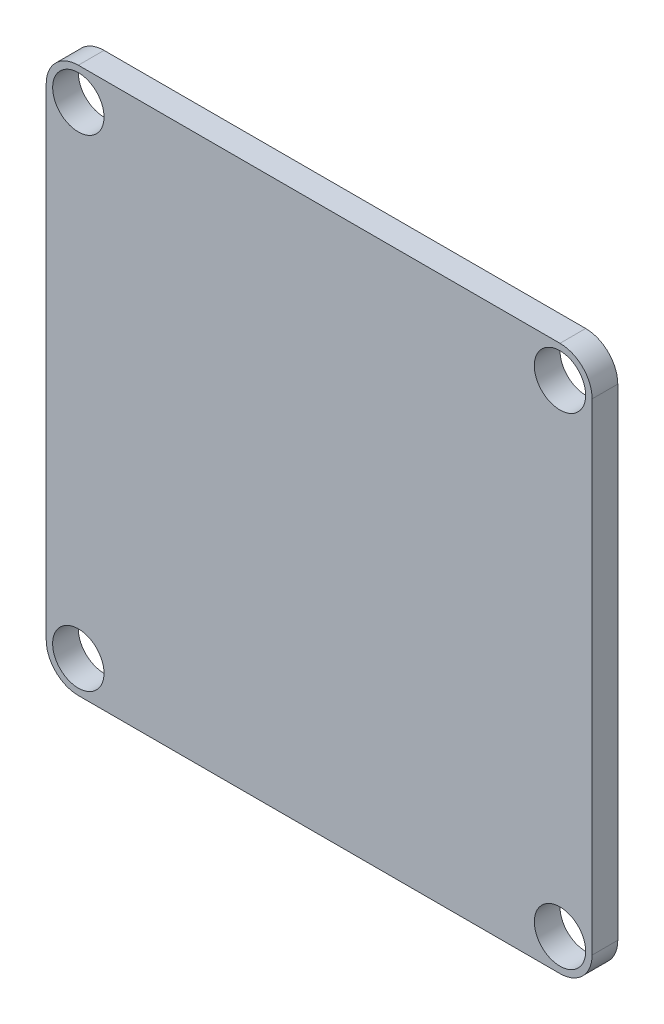
ISO-10303-21;
HEADER;
FILE_DESCRIPTION(('STEP AP214'),'2;1');
FILE_NAME('part.step','',(''),(''),'','','');
FILE_SCHEMA(('AUTOMOTIVE_DESIGN { 1 0 10303 214 1 1 1 1 }'));
ENDSEC;
DATA;
#1=APPLICATION_CONTEXT('core data for automotive mechanical design processes');
#2=APPLICATION_PROTOCOL_DEFINITION('international standard','automotive_design',2000,#1);
#3=PRODUCT_CONTEXT('',#1,'mechanical');
#4=PRODUCT('Part','Part','',(#3));
#5=PRODUCT_RELATED_PRODUCT_CATEGORY('part','',(#4));
#6=PRODUCT_DEFINITION_FORMATION('','',#4);
#7=PRODUCT_DEFINITION_CONTEXT('part definition',#1,'design');
#8=PRODUCT_DEFINITION('design','',#6,#7);
#9=PRODUCT_DEFINITION_SHAPE('','',#8);
#10=(LENGTH_UNIT() NAMED_UNIT(*) SI_UNIT(.MILLI.,.METRE.));
#11=(NAMED_UNIT(*) PLANE_ANGLE_UNIT() SI_UNIT($,.RADIAN.));
#12=(NAMED_UNIT(*) SI_UNIT($,.STERADIAN.) SOLID_ANGLE_UNIT());
#13=UNCERTAINTY_MEASURE_WITH_UNIT(LENGTH_MEASURE(1.E-05),#10,'distance_accuracy_value','');
#14=(GEOMETRIC_REPRESENTATION_CONTEXT(3) GLOBAL_UNCERTAINTY_ASSIGNED_CONTEXT((#13)) GLOBAL_UNIT_ASSIGNED_CONTEXT((#10,
#11,#12)) REPRESENTATION_CONTEXT('',''));
#15=CARTESIAN_POINT('',(0.,0.,0.));
#16=DIRECTION('',(0.,0.,1.));
#17=DIRECTION('',(1.,0.,0.));
#18=AXIS2_PLACEMENT_3D('',#15,#16,#17);
#19=CARTESIAN_POINT('',(-13.2356576243425,11.611622238612,1.6));
#20=DIRECTION('',(0.,0.,1.));
#21=DIRECTION('',(1.,0.,0.));
#22=AXIS2_PLACEMENT_3D('',#19,#20,#21);
#23=PLANE('',#22);
#24=CARTESIAN_POINT('',(-13.2356576243425,11.611622238612,1.6));
#25=DIRECTION('',(0.,0.,1.));
#26=DIRECTION('',(-1.,0.,0.));
#27=AXIS2_PLACEMENT_3D('',#24,#25,#26);
#28=CIRCLE('',#27,1.6);
#29=CARTESIAN_POINT('',(-14.8356576243425,11.611622238612,1.6));
#30=VERTEX_POINT('',#29);
#31=EDGE_CURVE('E187',#30,#30,#28,.T.);
#32=ORIENTED_EDGE('',*,*,#31,.F.);
#33=EDGE_LOOP('',(#32));
#34=FACE_BOUND('',#33,.T.);
#35=CARTESIAN_POINT('',(16.7643423756575,11.611622238612,1.6));
#36=DIRECTION('',(0.,0.,1.));
#37=DIRECTION('',(1.,0.,0.));
#38=AXIS2_PLACEMENT_3D('',#35,#36,#37);
#39=CIRCLE('',#38,1.6);
#40=CARTESIAN_POINT('',(18.3643423756575,11.611622238612,1.6));
#41=VERTEX_POINT('',#40);
#42=EDGE_CURVE('E133',#41,#41,#39,.T.);
#43=ORIENTED_EDGE('',*,*,#42,.F.);
#44=EDGE_LOOP('',(#43));
#45=FACE_BOUND('',#44,.T.);
#46=CARTESIAN_POINT('',(-13.2356576243425,11.611622238612,1.6));
#47=DIRECTION('',(0.,0.,1.));
#48=DIRECTION('',(1.,0.,0.));
#49=AXIS2_PLACEMENT_3D('',#46,#47,#48);
#50=CIRCLE('',#49,2.);
#51=CARTESIAN_POINT('',(-13.2356576243425,13.611622238612,1.6));
#52=VERTEX_POINT('',#51);
#53=CARTESIAN_POINT('',(-15.2356576243425,11.611622238612,1.6));
#54=VERTEX_POINT('',#53);
#55=EDGE_CURVE('E144',#52,#54,#50,.T.);
#56=ORIENTED_EDGE('',*,*,#55,.T.);
#57=DIRECTION('',(0.,-1.,0.));
#58=VECTOR('',#57,1.);
#59=CARTESIAN_POINT('',(-15.2356576243425,11.611622238612,1.6));
#60=LINE('',#59,#58);
#61=CARTESIAN_POINT('',(-15.2356576243425,-18.388377761388,1.6));
#62=VERTEX_POINT('',#61);
#63=EDGE_CURVE('E92',#54,#62,#60,.T.);
#64=ORIENTED_EDGE('',*,*,#63,.T.);
#65=CARTESIAN_POINT('',(-13.2356576243425,-18.388377761388,1.6));
#66=DIRECTION('',(0.,0.,1.));
#67=DIRECTION('',(1.,0.,0.));
#68=AXIS2_PLACEMENT_3D('',#65,#66,#67);
#69=CIRCLE('',#68,2.);
#70=CARTESIAN_POINT('',(-13.2356576243425,-20.388377761388,1.6));
#71=VERTEX_POINT('',#70);
#72=EDGE_CURVE('E159',#62,#71,#69,.T.);
#73=ORIENTED_EDGE('',*,*,#72,.T.);
#74=DIRECTION('',(1.,0.,0.));
#75=VECTOR('',#74,1.);
#76=CARTESIAN_POINT('',(-13.2356576243425,-20.388377761388,1.6));
#77=LINE('',#76,#75);
#78=CARTESIAN_POINT('',(16.7643423756575,-20.388377761388,1.6));
#79=VERTEX_POINT('',#78);
#80=EDGE_CURVE('E172',#71,#79,#77,.T.);
#81=ORIENTED_EDGE('',*,*,#80,.T.);
#82=CARTESIAN_POINT('',(16.7643423756575,-18.388377761388,1.6));
#83=DIRECTION('',(0.,0.,1.));
#84=DIRECTION('',(1.,0.,0.));
#85=AXIS2_PLACEMENT_3D('',#82,#83,#84);
#86=CIRCLE('',#85,2.);
#87=CARTESIAN_POINT('',(18.7643423756575,-18.388377761388,1.6));
#88=VERTEX_POINT('',#87);
#89=EDGE_CURVE('E111',#79,#88,#86,.T.);
#90=ORIENTED_EDGE('',*,*,#89,.T.);
#91=DIRECTION('',(0.,1.,0.));
#92=VECTOR('',#91,1.);
#93=CARTESIAN_POINT('',(18.7643423756575,11.611622238612,1.6));
#94=LINE('',#93,#92);
#95=CARTESIAN_POINT('',(18.7643423756575,11.611622238612,1.6));
#96=VERTEX_POINT('',#95);
#97=EDGE_CURVE('E105',#88,#96,#94,.T.);
#98=ORIENTED_EDGE('',*,*,#97,.T.);
#99=CARTESIAN_POINT('',(16.7643423756575,11.611622238612,1.6));
#100=DIRECTION('',(0.,0.,1.));
#101=DIRECTION('',(-1.,0.,0.));
#102=AXIS2_PLACEMENT_3D('',#99,#100,#101);
#103=CIRCLE('',#102,2.);
#104=CARTESIAN_POINT('',(16.7643423756575,13.611622238612,1.6));
#105=VERTEX_POINT('',#104);
#106=EDGE_CURVE('E109',#96,#105,#103,.T.);
#107=ORIENTED_EDGE('',*,*,#106,.T.);
#108=DIRECTION('',(-1.,0.,0.));
#109=VECTOR('',#108,1.);
#110=CARTESIAN_POINT('',(-13.2356576243425,13.611622238612,1.6));
#111=LINE('',#110,#109);
#112=EDGE_CURVE('E49',#105,#52,#111,.T.);
#113=ORIENTED_EDGE('',*,*,#112,.T.);
#114=EDGE_LOOP('',(#56,#64,#73,#81,#90,#98,#107,#113));
#115=FACE_BOUND('',#114,.T.);
#116=CARTESIAN_POINT('',(16.7643423756575,-18.388377761388,1.6));
#117=DIRECTION('',(0.,0.,1.));
#118=DIRECTION('',(-1.,0.,0.));
#119=AXIS2_PLACEMENT_3D('',#116,#117,#118);
#120=CIRCLE('',#119,1.6);
#121=CARTESIAN_POINT('',(15.1643423756575,-18.388377761388,1.6));
#122=VERTEX_POINT('',#121);
#123=EDGE_CURVE('E181',#122,#122,#120,.T.);
#124=ORIENTED_EDGE('',*,*,#123,.F.);
#125=EDGE_LOOP('',(#124));
#126=FACE_BOUND('',#125,.T.);
#127=CARTESIAN_POINT('',(-13.2356576243425,-18.388377761388,1.6));
#128=DIRECTION('',(0.,0.,1.));
#129=DIRECTION('',(1.,0.,0.));
#130=AXIS2_PLACEMENT_3D('',#127,#128,#129);
#131=CIRCLE('',#130,1.6);
#132=CARTESIAN_POINT('',(-11.6356576243425,-18.388377761388,1.6));
#133=VERTEX_POINT('',#132);
#134=EDGE_CURVE('E193',#133,#133,#131,.T.);
#135=ORIENTED_EDGE('',*,*,#134,.F.);
#136=EDGE_LOOP('',(#135));
#137=FACE_BOUND('',#136,.T.);
#138=ADVANCED_FACE('F32',(#34,#45,#115,#126,#137),#23,.T.);
#139=CARTESIAN_POINT('',(-13.2356576243425,11.611622238612,0.));
#140=DIRECTION('',(0.,0.,1.));
#141=DIRECTION('',(1.,0.,0.));
#142=AXIS2_PLACEMENT_3D('',#139,#140,#141);
#143=PLANE('',#142);
#144=CARTESIAN_POINT('',(-13.2356576243425,11.611622238612,0.));
#145=DIRECTION('',(0.,0.,1.));
#146=DIRECTION('',(1.,0.,0.));
#147=AXIS2_PLACEMENT_3D('',#144,#145,#146);
#148=CIRCLE('',#147,2.);
#149=CARTESIAN_POINT('',(-13.2356576243425,13.611622238612,0.));
#150=VERTEX_POINT('',#149);
#151=CARTESIAN_POINT('',(-15.2356576243425,11.611622238612,0.));
#152=VERTEX_POINT('',#151);
#153=EDGE_CURVE('E129',#150,#152,#148,.T.);
#154=ORIENTED_EDGE('',*,*,#153,.F.);
#155=DIRECTION('',(-1.,0.,0.));
#156=VECTOR('',#155,1.);
#157=CARTESIAN_POINT('',(-13.2356576243425,13.611622238612,0.));
#158=LINE('',#157,#156);
#159=CARTESIAN_POINT('',(16.7643423756575,13.611622238612,0.));
#160=VERTEX_POINT('',#159);
#161=EDGE_CURVE('E84',#160,#150,#158,.T.);
#162=ORIENTED_EDGE('',*,*,#161,.F.);
#163=CARTESIAN_POINT('',(16.7643423756575,11.611622238612,0.));
#164=DIRECTION('',(0.,0.,1.));
#165=DIRECTION('',(-1.,0.,0.));
#166=AXIS2_PLACEMENT_3D('',#163,#164,#165);
#167=CIRCLE('',#166,2.);
#168=CARTESIAN_POINT('',(18.7643423756575,11.611622238612,0.));
#169=VERTEX_POINT('',#168);
#170=EDGE_CURVE('E78',#169,#160,#167,.T.);
#171=ORIENTED_EDGE('',*,*,#170,.F.);
#172=DIRECTION('',(0.,1.,0.));
#173=VECTOR('',#172,1.);
#174=CARTESIAN_POINT('',(18.7643423756575,11.611622238612,0.));
#175=LINE('',#174,#173);
#176=CARTESIAN_POINT('',(18.7643423756575,-18.388377761388,0.));
#177=VERTEX_POINT('',#176);
#178=EDGE_CURVE('E119',#177,#169,#175,.T.);
#179=ORIENTED_EDGE('',*,*,#178,.F.);
#180=CARTESIAN_POINT('',(16.7643423756575,-18.388377761388,0.));
#181=DIRECTION('',(0.,0.,1.));
#182=DIRECTION('',(1.,0.,0.));
#183=AXIS2_PLACEMENT_3D('',#180,#181,#182);
#184=CIRCLE('',#183,2.);
#185=CARTESIAN_POINT('',(16.7643423756575,-20.388377761388,0.));
#186=VERTEX_POINT('',#185);
#187=EDGE_CURVE('E139',#186,#177,#184,.T.);
#188=ORIENTED_EDGE('',*,*,#187,.F.);
#189=DIRECTION('',(1.,0.,0.));
#190=VECTOR('',#189,1.);
#191=CARTESIAN_POINT('',(-13.2356576243425,-20.388377761388,0.));
#192=LINE('',#191,#190);
#193=CARTESIAN_POINT('',(-13.2356576243425,-20.388377761388,0.));
#194=VERTEX_POINT('',#193);
#195=EDGE_CURVE('E137',#194,#186,#192,.T.);
#196=ORIENTED_EDGE('',*,*,#195,.F.);
#197=CARTESIAN_POINT('',(-13.2356576243425,-18.388377761388,0.));
#198=DIRECTION('',(0.,0.,1.));
#199=DIRECTION('',(1.,0.,0.));
#200=AXIS2_PLACEMENT_3D('',#197,#198,#199);
#201=CIRCLE('',#200,2.);
#202=CARTESIAN_POINT('',(-15.2356576243425,-18.388377761388,0.));
#203=VERTEX_POINT('',#202);
#204=EDGE_CURVE('E135',#203,#194,#201,.T.);
#205=ORIENTED_EDGE('',*,*,#204,.F.);
#206=DIRECTION('',(0.,-1.,0.));
#207=VECTOR('',#206,1.);
#208=CARTESIAN_POINT('',(-15.2356576243425,11.611622238612,0.));
#209=LINE('',#208,#207);
#210=EDGE_CURVE('E132',#152,#203,#209,.T.);
#211=ORIENTED_EDGE('',*,*,#210,.F.);
#212=EDGE_LOOP('',(#154,#162,#171,#179,#188,#196,#205,#211));
#213=FACE_BOUND('',#212,.T.);
#214=CARTESIAN_POINT('',(16.7643423756575,11.611622238612,0.));
#215=DIRECTION('',(0.,0.,1.));
#216=DIRECTION('',(1.,0.,0.));
#217=AXIS2_PLACEMENT_3D('',#214,#215,#216);
#218=CIRCLE('',#217,1.6);
#219=CARTESIAN_POINT('',(18.3643423756575,11.611622238612,0.));
#220=VERTEX_POINT('',#219);
#221=EDGE_CURVE('E178',#220,#220,#218,.T.);
#222=ORIENTED_EDGE('',*,*,#221,.T.);
#223=EDGE_LOOP('',(#222));
#224=FACE_BOUND('',#223,.T.);
#225=CARTESIAN_POINT('',(16.7643423756575,-18.388377761388,0.));
#226=DIRECTION('',(0.,0.,1.));
#227=DIRECTION('',(-1.,0.,0.));
#228=AXIS2_PLACEMENT_3D('',#225,#226,#227);
#229=CIRCLE('',#228,1.6);
#230=CARTESIAN_POINT('',(15.1643423756575,-18.388377761388,0.));
#231=VERTEX_POINT('',#230);
#232=EDGE_CURVE('E184',#231,#231,#229,.T.);
#233=ORIENTED_EDGE('',*,*,#232,.T.);
#234=EDGE_LOOP('',(#233));
#235=FACE_BOUND('',#234,.T.);
#236=CARTESIAN_POINT('',(-13.2356576243425,11.611622238612,0.));
#237=DIRECTION('',(0.,0.,1.));
#238=DIRECTION('',(-1.,0.,0.));
#239=AXIS2_PLACEMENT_3D('',#236,#237,#238);
#240=CIRCLE('',#239,1.6);
#241=CARTESIAN_POINT('',(-14.8356576243425,11.611622238612,0.));
#242=VERTEX_POINT('',#241);
#243=EDGE_CURVE('E190',#242,#242,#240,.T.);
#244=ORIENTED_EDGE('',*,*,#243,.T.);
#245=EDGE_LOOP('',(#244));
#246=FACE_BOUND('',#245,.T.);
#247=CARTESIAN_POINT('',(-13.2356576243425,-18.388377761388,0.));
#248=DIRECTION('',(0.,0.,1.));
#249=DIRECTION('',(1.,0.,0.));
#250=AXIS2_PLACEMENT_3D('',#247,#248,#249);
#251=CIRCLE('',#250,1.6);
#252=CARTESIAN_POINT('',(-11.6356576243425,-18.388377761388,0.));
#253=VERTEX_POINT('',#252);
#254=EDGE_CURVE('E196',#253,#253,#251,.T.);
#255=ORIENTED_EDGE('',*,*,#254,.T.);
#256=EDGE_LOOP('',(#255));
#257=FACE_BOUND('',#256,.T.);
#258=ADVANCED_FACE('F163',(#213,#224,#235,#246,#257),#143,.F.);
#259=CARTESIAN_POINT('',(-13.2356576243425,11.611622238612,1.6));
#260=DIRECTION('',(0.,0.,-1.));
#261=DIRECTION('',(-1.,0.,0.));
#262=AXIS2_PLACEMENT_3D('',#259,#260,#261);
#263=CYLINDRICAL_SURFACE('',#262,2.);
#264=ORIENTED_EDGE('',*,*,#153,.T.);
#265=DIRECTION('',(0.,0.,-1.));
#266=VECTOR('',#265,1.);
#267=CARTESIAN_POINT('',(-15.2356576243425,11.611622238612,1.6));
#268=LINE('',#267,#266);
#269=EDGE_CURVE('E11',#54,#152,#268,.T.);
#270=ORIENTED_EDGE('',*,*,#269,.F.);
#271=ORIENTED_EDGE('',*,*,#55,.F.);
#272=DIRECTION('',(0.,0.,-1.));
#273=VECTOR('',#272,1.);
#274=CARTESIAN_POINT('',(-13.2356576243425,13.611622238612,1.6));
#275=LINE('',#274,#273);
#276=EDGE_CURVE('E125',#52,#150,#275,.T.);
#277=ORIENTED_EDGE('',*,*,#276,.T.);
#278=EDGE_LOOP('',(#264,#270,#271,#277));
#279=FACE_BOUND('',#278,.T.);
#280=ADVANCED_FACE('F34',(#279),#263,.T.);
#281=CARTESIAN_POINT('',(-15.2356576243425,11.611622238612,1.6));
#282=DIRECTION('',(1.,0.,0.));
#283=DIRECTION('',(0.,1.,0.));
#284=AXIS2_PLACEMENT_3D('',#281,#282,#283);
#285=PLANE('',#284);
#286=ORIENTED_EDGE('',*,*,#210,.T.);
#287=DIRECTION('',(0.,0.,-1.));
#288=VECTOR('',#287,1.);
#289=CARTESIAN_POINT('',(-15.2356576243425,-18.388377761388,1.6));
#290=LINE('',#289,#288);
#291=EDGE_CURVE('E41',#62,#203,#290,.T.);
#292=ORIENTED_EDGE('',*,*,#291,.F.);
#293=ORIENTED_EDGE('',*,*,#63,.F.);
#294=ORIENTED_EDGE('',*,*,#269,.T.);
#295=EDGE_LOOP('',(#286,#292,#293,#294));
#296=FACE_BOUND('',#295,.T.);
#297=ADVANCED_FACE('F230',(#296),#285,.F.);
#298=CARTESIAN_POINT('',(-13.2356576243425,-18.388377761388,1.6));
#299=DIRECTION('',(0.,0.,-1.));
#300=DIRECTION('',(-1.,0.,0.));
#301=AXIS2_PLACEMENT_3D('',#298,#299,#300);
#302=CYLINDRICAL_SURFACE('',#301,2.);
#303=ORIENTED_EDGE('',*,*,#204,.T.);
#304=DIRECTION('',(0.,0.,-1.));
#305=VECTOR('',#304,1.);
#306=CARTESIAN_POINT('',(-13.2356576243425,-20.388377761388,1.6));
#307=LINE('',#306,#305);
#308=EDGE_CURVE('E151',#71,#194,#307,.T.);
#309=ORIENTED_EDGE('',*,*,#308,.F.);
#310=ORIENTED_EDGE('',*,*,#72,.F.);
#311=ORIENTED_EDGE('',*,*,#291,.T.);
#312=EDGE_LOOP('',(#303,#309,#310,#311));
#313=FACE_BOUND('',#312,.T.);
#314=ADVANCED_FACE('F157',(#313),#302,.T.);
#315=CARTESIAN_POINT('',(-13.2356576243425,-20.388377761388,1.6));
#316=DIRECTION('',(0.,1.,0.));
#317=DIRECTION('',(0.,0.,1.));
#318=AXIS2_PLACEMENT_3D('',#315,#316,#317);
#319=PLANE('',#318);
#320=ORIENTED_EDGE('',*,*,#195,.T.);
#321=DIRECTION('',(0.,0.,-1.));
#322=VECTOR('',#321,1.);
#323=CARTESIAN_POINT('',(16.7643423756575,-20.388377761388,1.6));
#324=LINE('',#323,#322);
#325=EDGE_CURVE('E148',#79,#186,#324,.T.);
#326=ORIENTED_EDGE('',*,*,#325,.F.);
#327=ORIENTED_EDGE('',*,*,#80,.F.);
#328=ORIENTED_EDGE('',*,*,#308,.T.);
#329=EDGE_LOOP('',(#320,#326,#327,#328));
#330=FACE_BOUND('',#329,.T.);
#331=ADVANCED_FACE('F168',(#330),#319,.F.);
#332=CARTESIAN_POINT('',(16.7643423756575,-18.388377761388,1.6));
#333=DIRECTION('',(0.,0.,-1.));
#334=DIRECTION('',(-1.,0.,0.));
#335=AXIS2_PLACEMENT_3D('',#332,#333,#334);
#336=CYLINDRICAL_SURFACE('',#335,2.);
#337=ORIENTED_EDGE('',*,*,#187,.T.);
#338=DIRECTION('',(0.,0.,-1.));
#339=VECTOR('',#338,1.);
#340=CARTESIAN_POINT('',(18.7643423756575,-18.388377761388,1.6));
#341=LINE('',#340,#339);
#342=EDGE_CURVE('E120',#88,#177,#341,.T.);
#343=ORIENTED_EDGE('',*,*,#342,.F.);
#344=ORIENTED_EDGE('',*,*,#89,.F.);
#345=ORIENTED_EDGE('',*,*,#325,.T.);
#346=EDGE_LOOP('',(#337,#343,#344,#345));
#347=FACE_BOUND('',#346,.T.);
#348=ADVANCED_FACE('F171',(#347),#336,.T.);
#349=CARTESIAN_POINT('',(18.7643423756575,11.611622238612,1.6));
#350=DIRECTION('',(-1.,0.,0.));
#351=DIRECTION('',(0.,0.,1.));
#352=AXIS2_PLACEMENT_3D('',#349,#350,#351);
#353=PLANE('',#352);
#354=ORIENTED_EDGE('',*,*,#178,.T.);
#355=DIRECTION('',(0.,0.,-1.));
#356=VECTOR('',#355,1.);
#357=CARTESIAN_POINT('',(18.7643423756575,11.611622238612,1.6));
#358=LINE('',#357,#356);
#359=EDGE_CURVE('E116',#96,#169,#358,.T.);
#360=ORIENTED_EDGE('',*,*,#359,.F.);
#361=ORIENTED_EDGE('',*,*,#97,.F.);
#362=ORIENTED_EDGE('',*,*,#342,.T.);
#363=EDGE_LOOP('',(#354,#360,#361,#362));
#364=FACE_BOUND('',#363,.T.);
#365=ADVANCED_FACE('F117',(#364),#353,.F.);
#366=CARTESIAN_POINT('',(16.7643423756575,11.611622238612,1.6));
#367=DIRECTION('',(0.,0.,-1.));
#368=DIRECTION('',(-1.,0.,0.));
#369=AXIS2_PLACEMENT_3D('',#366,#367,#368);
#370=CYLINDRICAL_SURFACE('',#369,2.);
#371=ORIENTED_EDGE('',*,*,#170,.T.);
#372=DIRECTION('',(0.,0.,-1.));
#373=VECTOR('',#372,1.);
#374=CARTESIAN_POINT('',(16.7643423756575,13.611622238612,1.6));
#375=LINE('',#374,#373);
#376=EDGE_CURVE('E121',#105,#160,#375,.T.);
#377=ORIENTED_EDGE('',*,*,#376,.F.);
#378=ORIENTED_EDGE('',*,*,#106,.F.);
#379=ORIENTED_EDGE('',*,*,#359,.T.);
#380=EDGE_LOOP('',(#371,#377,#378,#379));
#381=FACE_BOUND('',#380,.T.);
#382=ADVANCED_FACE('F123',(#381),#370,.T.);
#383=CARTESIAN_POINT('',(-13.2356576243425,13.611622238612,1.6));
#384=DIRECTION('',(0.,-1.,0.));
#385=DIRECTION('',(0.,0.,-1.));
#386=AXIS2_PLACEMENT_3D('',#383,#384,#385);
#387=PLANE('',#386);
#388=ORIENTED_EDGE('',*,*,#161,.T.);
#389=ORIENTED_EDGE('',*,*,#276,.F.);
#390=ORIENTED_EDGE('',*,*,#112,.F.);
#391=ORIENTED_EDGE('',*,*,#376,.T.);
#392=EDGE_LOOP('',(#388,#389,#390,#391));
#393=FACE_BOUND('',#392,.T.);
#394=ADVANCED_FACE('F218',(#393),#387,.F.);
#395=CARTESIAN_POINT('',(16.7643423756575,11.611622238612,1.6));
#396=DIRECTION('',(0.,0.,-1.));
#397=DIRECTION('',(-1.,0.,0.));
#398=AXIS2_PLACEMENT_3D('',#395,#396,#397);
#399=CYLINDRICAL_SURFACE('',#398,1.6);
#400=ORIENTED_EDGE('',*,*,#42,.T.);
#401=EDGE_LOOP('',(#400));
#402=FACE_BOUND('',#401,.T.);
#403=ORIENTED_EDGE('',*,*,#221,.F.);
#404=EDGE_LOOP('',(#403));
#405=FACE_BOUND('',#404,.T.);
#406=ADVANCED_FACE('F215',(#402,#405),#399,.F.);
#407=CARTESIAN_POINT('',(16.7643423756575,-18.388377761388,1.6));
#408=DIRECTION('',(0.,0.,-1.));
#409=DIRECTION('',(-1.,0.,0.));
#410=AXIS2_PLACEMENT_3D('',#407,#408,#409);
#411=CYLINDRICAL_SURFACE('',#410,1.6);
#412=ORIENTED_EDGE('',*,*,#123,.T.);
#413=EDGE_LOOP('',(#412));
#414=FACE_BOUND('',#413,.T.);
#415=ORIENTED_EDGE('',*,*,#232,.F.);
#416=EDGE_LOOP('',(#415));
#417=FACE_BOUND('',#416,.T.);
#418=ADVANCED_FACE('F294',(#414,#417),#411,.F.);
#419=CARTESIAN_POINT('',(-13.2356576243425,11.611622238612,1.6));
#420=DIRECTION('',(0.,0.,-1.));
#421=DIRECTION('',(-1.,0.,0.));
#422=AXIS2_PLACEMENT_3D('',#419,#420,#421);
#423=CYLINDRICAL_SURFACE('',#422,1.6);
#424=ORIENTED_EDGE('',*,*,#31,.T.);
#425=EDGE_LOOP('',(#424));
#426=FACE_BOUND('',#425,.T.);
#427=ORIENTED_EDGE('',*,*,#243,.F.);
#428=EDGE_LOOP('',(#427));
#429=FACE_BOUND('',#428,.T.);
#430=ADVANCED_FACE('F302',(#426,#429),#423,.F.);
#431=CARTESIAN_POINT('',(-13.2356576243425,-18.388377761388,1.6));
#432=DIRECTION('',(0.,0.,-1.));
#433=DIRECTION('',(-1.,0.,0.));
#434=AXIS2_PLACEMENT_3D('',#431,#432,#433);
#435=CYLINDRICAL_SURFACE('',#434,1.6);
#436=ORIENTED_EDGE('',*,*,#134,.T.);
#437=EDGE_LOOP('',(#436));
#438=FACE_BOUND('',#437,.T.);
#439=ORIENTED_EDGE('',*,*,#254,.F.);
#440=EDGE_LOOP('',(#439));
#441=FACE_BOUND('',#440,.T.);
#442=ADVANCED_FACE('F202',(#438,#441),#435,.F.);
#443=CLOSED_SHELL('',(#138,#258,#280,#297,#314,#331,#348,#365,#382,#394,#406,#418,#430,#442));
#444=MANIFOLD_SOLID_BREP('B2',#443);
#445=ADVANCED_BREP_SHAPE_REPRESENTATION('',(#18,#444),#14);
#446=SHAPE_DEFINITION_REPRESENTATION(#9,#445);
ENDSEC;
END-ISO-10303-21;
